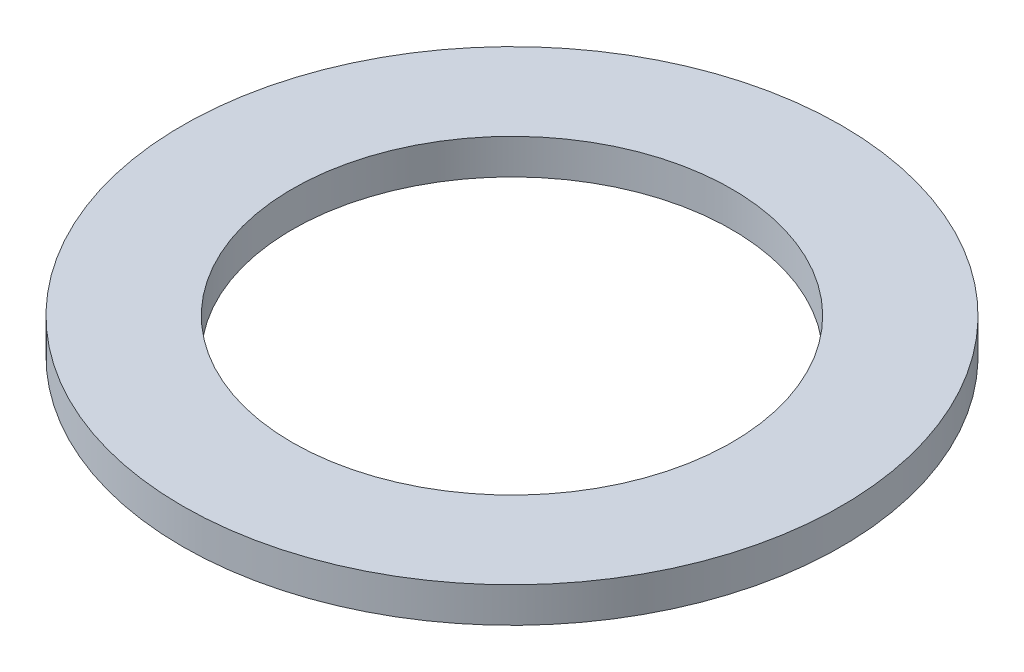
ISO-10303-21;
HEADER;
FILE_DESCRIPTION(('STEP AP214'),'2;1');
FILE_NAME('part.step','',(''),(''),'','','');
FILE_SCHEMA(('AUTOMOTIVE_DESIGN { 1 0 10303 214 1 1 1 1 }'));
ENDSEC;
DATA;
#1=APPLICATION_CONTEXT('core data for automotive mechanical design processes');
#2=APPLICATION_PROTOCOL_DEFINITION('international standard','automotive_design',2000,#1);
#3=PRODUCT_CONTEXT('',#1,'mechanical');
#4=PRODUCT('Part','Part','',(#3));
#5=PRODUCT_RELATED_PRODUCT_CATEGORY('part','',(#4));
#6=PRODUCT_DEFINITION_FORMATION('','',#4);
#7=PRODUCT_DEFINITION_CONTEXT('part definition',#1,'design');
#8=PRODUCT_DEFINITION('design','',#6,#7);
#9=PRODUCT_DEFINITION_SHAPE('','',#8);
#10=(LENGTH_UNIT() NAMED_UNIT(*) SI_UNIT(.MILLI.,.METRE.));
#11=(NAMED_UNIT(*) PLANE_ANGLE_UNIT() SI_UNIT($,.RADIAN.));
#12=(NAMED_UNIT(*) SI_UNIT($,.STERADIAN.) SOLID_ANGLE_UNIT());
#13=UNCERTAINTY_MEASURE_WITH_UNIT(LENGTH_MEASURE(1.E-05),#10,'distance_accuracy_value','');
#14=(GEOMETRIC_REPRESENTATION_CONTEXT(3) GLOBAL_UNCERTAINTY_ASSIGNED_CONTEXT((#13)) GLOBAL_UNIT_ASSIGNED_CONTEXT((#10,
#11,#12)) REPRESENTATION_CONTEXT('',''));
#15=CARTESIAN_POINT('',(0.,0.,0.));
#16=DIRECTION('',(0.,0.,1.));
#17=DIRECTION('',(1.,0.,0.));
#18=AXIS2_PLACEMENT_3D('',#15,#16,#17);
#19=CARTESIAN_POINT('',(0.,1.016,0.));
#20=DIRECTION('',(0.,1.,0.));
#21=DIRECTION('',(0.,0.,1.));
#22=AXIS2_PLACEMENT_3D('',#19,#20,#21);
#23=PLANE('',#22);
#24=CARTESIAN_POINT('',(0.,1.016,0.));
#25=DIRECTION('',(0.,1.,0.));
#26=DIRECTION('',(0.,0.,1.));
#27=AXIS2_PLACEMENT_3D('',#24,#25,#26);
#28=CIRCLE('',#27,9.525);
#29=CARTESIAN_POINT('',(0.,1.016,9.525));
#30=VERTEX_POINT('',#29);
#31=EDGE_CURVE('E10',#30,#30,#28,.T.);
#32=ORIENTED_EDGE('',*,*,#31,.T.);
#33=EDGE_LOOP('',(#32));
#34=FACE_BOUND('',#33,.T.);
#35=CARTESIAN_POINT('',(0.,1.016,0.));
#36=DIRECTION('',(0.,1.,0.));
#37=DIRECTION('',(0.,0.,1.));
#38=AXIS2_PLACEMENT_3D('',#35,#36,#37);
#39=CIRCLE('',#38,6.35);
#40=CARTESIAN_POINT('',(0.,1.016,6.35));
#41=VERTEX_POINT('',#40);
#42=EDGE_CURVE('E41',#41,#41,#39,.T.);
#43=ORIENTED_EDGE('',*,*,#42,.F.);
#44=EDGE_LOOP('',(#43));
#45=FACE_BOUND('',#44,.T.);
#46=ADVANCED_FACE('F30',(#34,#45),#23,.T.);
#47=CARTESIAN_POINT('',(0.,0.,0.));
#48=DIRECTION('',(0.,1.,0.));
#49=DIRECTION('',(0.,0.,1.));
#50=AXIS2_PLACEMENT_3D('',#47,#48,#49);
#51=PLANE('',#50);
#52=CARTESIAN_POINT('',(0.,0.,0.));
#53=DIRECTION('',(0.,1.,0.));
#54=DIRECTION('',(0.,0.,1.));
#55=AXIS2_PLACEMENT_3D('',#52,#53,#54);
#56=CIRCLE('',#55,9.525);
#57=CARTESIAN_POINT('',(0.,0.,9.525));
#58=VERTEX_POINT('',#57);
#59=EDGE_CURVE('E34',#58,#58,#56,.T.);
#60=ORIENTED_EDGE('',*,*,#59,.F.);
#61=EDGE_LOOP('',(#60));
#62=FACE_BOUND('',#61,.T.);
#63=CARTESIAN_POINT('',(0.,0.,0.));
#64=DIRECTION('',(0.,1.,0.));
#65=DIRECTION('',(0.,0.,1.));
#66=AXIS2_PLACEMENT_3D('',#63,#64,#65);
#67=CIRCLE('',#66,6.35);
#68=CARTESIAN_POINT('',(0.,0.,6.35));
#69=VERTEX_POINT('',#68);
#70=EDGE_CURVE('E43',#69,#69,#67,.T.);
#71=ORIENTED_EDGE('',*,*,#70,.T.);
#72=EDGE_LOOP('',(#71));
#73=FACE_BOUND('',#72,.T.);
#74=ADVANCED_FACE('F53',(#62,#73),#51,.F.);
#75=CARTESIAN_POINT('',(0.,1.016,0.));
#76=DIRECTION('',(0.,-1.,0.));
#77=DIRECTION('',(0.,0.,-1.));
#78=AXIS2_PLACEMENT_3D('',#75,#76,#77);
#79=CYLINDRICAL_SURFACE('',#78,9.525);
#80=ORIENTED_EDGE('',*,*,#31,.F.);
#81=EDGE_LOOP('',(#80));
#82=FACE_BOUND('',#81,.T.);
#83=ORIENTED_EDGE('',*,*,#59,.T.);
#84=EDGE_LOOP('',(#83));
#85=FACE_BOUND('',#84,.T.);
#86=ADVANCED_FACE('F32',(#82,#85),#79,.T.);
#87=CARTESIAN_POINT('',(0.,1.016,0.));
#88=DIRECTION('',(0.,-1.,0.));
#89=DIRECTION('',(0.,0.,-1.));
#90=AXIS2_PLACEMENT_3D('',#87,#88,#89);
#91=CYLINDRICAL_SURFACE('',#90,6.35);
#92=ORIENTED_EDGE('',*,*,#42,.T.);
#93=EDGE_LOOP('',(#92));
#94=FACE_BOUND('',#93,.T.);
#95=ORIENTED_EDGE('',*,*,#70,.F.);
#96=EDGE_LOOP('',(#95));
#97=FACE_BOUND('',#96,.T.);
#98=ADVANCED_FACE('F49',(#94,#97),#91,.F.);
#99=CLOSED_SHELL('',(#46,#74,#86,#98));
#100=MANIFOLD_SOLID_BREP('B2',#99);
#101=ADVANCED_BREP_SHAPE_REPRESENTATION('',(#18,#100),#14);
#102=SHAPE_DEFINITION_REPRESENTATION(#9,#101);
ENDSEC;
END-ISO-10303-21;
